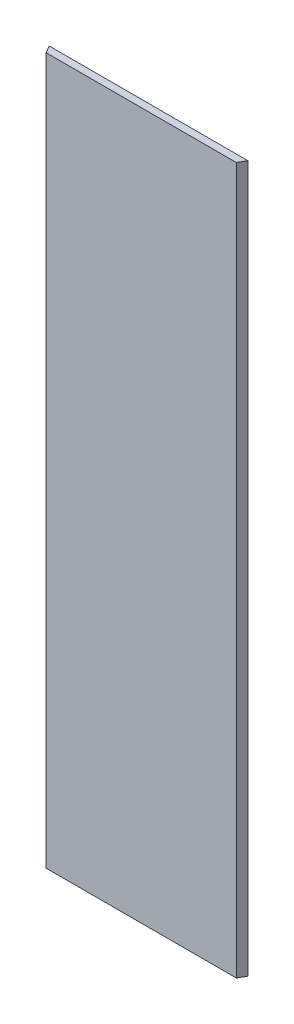
ISO-10303-21;
HEADER;
FILE_DESCRIPTION(('STEP AP214'),'2;1');
FILE_NAME('part.step','',(''),(''),'','','');
FILE_SCHEMA(('AUTOMOTIVE_DESIGN { 1 0 10303 214 1 1 1 1 }'));
ENDSEC;
DATA;
#1=APPLICATION_CONTEXT('core data for automotive mechanical design processes');
#2=APPLICATION_PROTOCOL_DEFINITION('international standard','automotive_design',2000,#1);
#3=PRODUCT_CONTEXT('',#1,'mechanical');
#4=PRODUCT('Part','Part','',(#3));
#5=PRODUCT_RELATED_PRODUCT_CATEGORY('part','',(#4));
#6=PRODUCT_DEFINITION_FORMATION('','',#4);
#7=PRODUCT_DEFINITION_CONTEXT('part definition',#1,'design');
#8=PRODUCT_DEFINITION('design','',#6,#7);
#9=PRODUCT_DEFINITION_SHAPE('','',#8);
#10=(LENGTH_UNIT() NAMED_UNIT(*) SI_UNIT(.MILLI.,.METRE.));
#11=(NAMED_UNIT(*) PLANE_ANGLE_UNIT() SI_UNIT($,.RADIAN.));
#12=(NAMED_UNIT(*) SI_UNIT($,.STERADIAN.) SOLID_ANGLE_UNIT());
#13=UNCERTAINTY_MEASURE_WITH_UNIT(LENGTH_MEASURE(1.E-05),#10,'distance_accuracy_value','');
#14=(GEOMETRIC_REPRESENTATION_CONTEXT(3) GLOBAL_UNCERTAINTY_ASSIGNED_CONTEXT((#13)) GLOBAL_UNIT_ASSIGNED_CONTEXT((#10,
#11,#12)) REPRESENTATION_CONTEXT('',''));
#15=CARTESIAN_POINT('',(0.,0.,0.));
#16=DIRECTION('',(0.,0.,1.));
#17=DIRECTION('',(1.,0.,0.));
#18=AXIS2_PLACEMENT_3D('',#15,#16,#17);
#19=CARTESIAN_POINT('',(-85.7250000000001,304.8,6.35));
#20=DIRECTION('',(0.,-1.,0.));
#21=DIRECTION('',(0.,0.,-1.));
#22=AXIS2_PLACEMENT_3D('',#19,#20,#21);
#23=PLANE('',#22);
#24=DIRECTION('',(-1.,0.,0.));
#25=VECTOR('',#24,1.);
#26=CARTESIAN_POINT('',(-85.7250000000001,304.8,6.35));
#27=LINE('',#26,#25);
#28=CARTESIAN_POINT('',(82.058825790646,304.8,6.35));
#29=VERTEX_POINT('',#28);
#30=CARTESIAN_POINT('',(-82.058825790646,304.8,6.35));
#31=VERTEX_POINT('',#30);
#32=EDGE_CURVE('E41',#29,#31,#27,.T.);
#33=ORIENTED_EDGE('',*,*,#32,.F.);
#34=DIRECTION('',(-0.499999999999994,0.,0.866025403784442));
#35=VECTOR('',#34,1.);
#36=CARTESIAN_POINT('',(82.058825790646,304.8,6.35));
#37=LINE('',#36,#35);
#38=CARTESIAN_POINT('',(85.7250000000001,304.8,0.));
#39=VERTEX_POINT('',#38);
#40=EDGE_CURVE('E77',#39,#29,#37,.T.);
#41=ORIENTED_EDGE('',*,*,#40,.F.);
#42=DIRECTION('',(-1.,0.,0.));
#43=VECTOR('',#42,1.);
#44=CARTESIAN_POINT('',(-85.7250000000001,304.8,0.));
#45=LINE('',#44,#43);
#46=CARTESIAN_POINT('',(-85.7250000000001,304.8,0.));
#47=VERTEX_POINT('',#46);
#48=EDGE_CURVE('E94',#39,#47,#45,.T.);
#49=ORIENTED_EDGE('',*,*,#48,.T.);
#50=DIRECTION('',(-0.499999999999994,0.,-0.866025403784442));
#51=VECTOR('',#50,1.);
#52=CARTESIAN_POINT('',(-82.058825790646,304.8,6.35));
#53=LINE('',#52,#51);
#54=EDGE_CURVE('E57',#31,#47,#53,.T.);
#55=ORIENTED_EDGE('',*,*,#54,.F.);
#56=EDGE_LOOP('',(#33,#41,#49,#55));
#57=FACE_BOUND('',#56,.T.);
#58=ADVANCED_FACE('F33',(#57),#23,.F.);
#59=CARTESIAN_POINT('',(-85.725,-304.8,6.35));
#60=DIRECTION('',(0.,1.,0.));
#61=DIRECTION('',(0.,0.,1.));
#62=AXIS2_PLACEMENT_3D('',#59,#60,#61);
#63=PLANE('',#62);
#64=DIRECTION('',(1.,0.,0.));
#65=VECTOR('',#64,1.);
#66=CARTESIAN_POINT('',(-85.725,-304.8,0.));
#67=LINE('',#66,#65);
#68=CARTESIAN_POINT('',(-85.7250000000001,-304.8,0.));
#69=VERTEX_POINT('',#68);
#70=CARTESIAN_POINT('',(85.725,-304.8,0.));
#71=VERTEX_POINT('',#70);
#72=EDGE_CURVE('E36',#69,#71,#67,.T.);
#73=ORIENTED_EDGE('',*,*,#72,.T.);
#74=DIRECTION('',(-0.499999999999994,0.,0.866025403784442));
#75=VECTOR('',#74,1.);
#76=CARTESIAN_POINT('',(82.058825790646,-304.8,6.35));
#77=LINE('',#76,#75);
#78=CARTESIAN_POINT('',(82.058825790646,-304.8,6.35));
#79=VERTEX_POINT('',#78);
#80=EDGE_CURVE('E49',#71,#79,#77,.T.);
#81=ORIENTED_EDGE('',*,*,#80,.T.);
#82=DIRECTION('',(1.,0.,0.));
#83=VECTOR('',#82,1.);
#84=CARTESIAN_POINT('',(-85.725,-304.8,6.35));
#85=LINE('',#84,#83);
#86=CARTESIAN_POINT('',(-82.058825790646,-304.8,6.35));
#87=VERTEX_POINT('',#86);
#88=EDGE_CURVE('E11',#87,#79,#85,.T.);
#89=ORIENTED_EDGE('',*,*,#88,.F.);
#90=DIRECTION('',(-0.499999999999994,0.,-0.866025403784442));
#91=VECTOR('',#90,1.);
#92=CARTESIAN_POINT('',(-82.058825790646,-304.8,6.35));
#93=LINE('',#92,#91);
#94=EDGE_CURVE('E92',#87,#69,#93,.T.);
#95=ORIENTED_EDGE('',*,*,#94,.T.);
#96=EDGE_LOOP('',(#73,#81,#89,#95));
#97=FACE_BOUND('',#96,.T.);
#98=ADVANCED_FACE('F83',(#97),#63,.F.);
#99=CARTESIAN_POINT('',(0.,0.,6.35));
#100=DIRECTION('',(0.,0.,1.));
#101=DIRECTION('',(1.,0.,0.));
#102=AXIS2_PLACEMENT_3D('',#99,#100,#101);
#103=PLANE('',#102);
#104=DIRECTION('',(0.,1.,0.));
#105=VECTOR('',#104,1.);
#106=CARTESIAN_POINT('',(82.058825790646,-304.8,6.35));
#107=LINE('',#106,#105);
#108=EDGE_CURVE('E74',#79,#29,#107,.T.);
#109=ORIENTED_EDGE('',*,*,#108,.T.);
#110=ORIENTED_EDGE('',*,*,#32,.T.);
#111=DIRECTION('',(0.,1.,0.));
#112=VECTOR('',#111,1.);
#113=CARTESIAN_POINT('',(-82.058825790646,-304.8,6.35));
#114=LINE('',#113,#112);
#115=EDGE_CURVE('E90',#87,#31,#114,.T.);
#116=ORIENTED_EDGE('',*,*,#115,.F.);
#117=ORIENTED_EDGE('',*,*,#88,.T.);
#118=EDGE_LOOP('',(#109,#110,#116,#117));
#119=FACE_BOUND('',#118,.T.);
#120=ADVANCED_FACE('F89',(#119),#103,.T.);
#121=CARTESIAN_POINT('',(0.,0.,0.));
#122=DIRECTION('',(0.,0.,1.));
#123=DIRECTION('',(1.,0.,0.));
#124=AXIS2_PLACEMENT_3D('',#121,#122,#123);
#125=PLANE('',#124);
#126=DIRECTION('',(0.,1.,0.));
#127=VECTOR('',#126,1.);
#128=CARTESIAN_POINT('',(85.7249999999999,304.8,0.));
#129=LINE('',#128,#127);
#130=EDGE_CURVE('E91',#71,#39,#129,.T.);
#131=ORIENTED_EDGE('',*,*,#130,.F.);
#132=ORIENTED_EDGE('',*,*,#72,.F.);
#133=DIRECTION('',(0.,-1.,0.));
#134=VECTOR('',#133,1.);
#135=CARTESIAN_POINT('',(-85.7250000000001,304.8,0.));
#136=LINE('',#135,#134);
#137=EDGE_CURVE('E100',#47,#69,#136,.T.);
#138=ORIENTED_EDGE('',*,*,#137,.F.);
#139=ORIENTED_EDGE('',*,*,#48,.F.);
#140=EDGE_LOOP('',(#131,#132,#138,#139));
#141=FACE_BOUND('',#140,.T.);
#142=ADVANCED_FACE('F105',(#141),#125,.F.);
#143=CARTESIAN_POINT('',(-82.058825790646,-304.8,6.35));
#144=DIRECTION('',(0.866025403784442,0.,-0.499999999999995));
#145=DIRECTION('',(-0.499999999999995,0.,-0.866025403784442));
#146=AXIS2_PLACEMENT_3D('',#143,#144,#145);
#147=PLANE('',#146);
#148=ORIENTED_EDGE('',*,*,#54,.T.);
#149=ORIENTED_EDGE('',*,*,#137,.T.);
#150=ORIENTED_EDGE('',*,*,#94,.F.);
#151=ORIENTED_EDGE('',*,*,#115,.T.);
#152=EDGE_LOOP('',(#148,#149,#150,#151));
#153=FACE_BOUND('',#152,.T.);
#154=ADVANCED_FACE('F102',(#153),#147,.F.);
#155=CARTESIAN_POINT('',(82.058825790646,-304.8,6.35));
#156=DIRECTION('',(-0.866025403784442,0.,-0.499999999999995));
#157=DIRECTION('',(-0.499999999999995,0.,0.866025403784442));
#158=AXIS2_PLACEMENT_3D('',#155,#156,#157);
#159=PLANE('',#158);
#160=ORIENTED_EDGE('',*,*,#40,.T.);
#161=ORIENTED_EDGE('',*,*,#108,.F.);
#162=ORIENTED_EDGE('',*,*,#80,.F.);
#163=ORIENTED_EDGE('',*,*,#130,.T.);
#164=EDGE_LOOP('',(#160,#161,#162,#163));
#165=FACE_BOUND('',#164,.T.);
#166=ADVANCED_FACE('F75',(#165),#159,.F.);
#167=CLOSED_SHELL('',(#58,#98,#120,#142,#154,#166));
#168=MANIFOLD_SOLID_BREP('B2',#167);
#169=ADVANCED_BREP_SHAPE_REPRESENTATION('',(#18,#168),#14);
#170=SHAPE_DEFINITION_REPRESENTATION(#9,#169);
ENDSEC;
END-ISO-10303-21;
